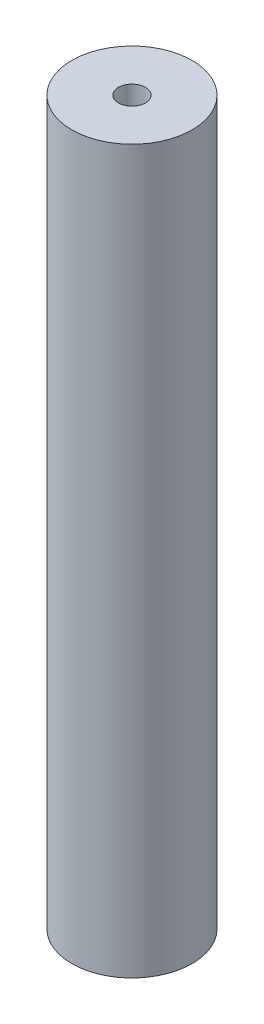
ISO-10303-21;
HEADER;
FILE_DESCRIPTION(('STEP AP214'),'2;1');
FILE_NAME('part.step','',(''),(''),'','','');
FILE_SCHEMA(('AUTOMOTIVE_DESIGN { 1 0 10303 214 1 1 1 1 }'));
ENDSEC;
DATA;
#1=APPLICATION_CONTEXT('core data for automotive mechanical design processes');
#2=APPLICATION_PROTOCOL_DEFINITION('international standard','automotive_design',2000,#1);
#3=PRODUCT_CONTEXT('',#1,'mechanical');
#4=PRODUCT('Part','Part','',(#3));
#5=PRODUCT_RELATED_PRODUCT_CATEGORY('part','',(#4));
#6=PRODUCT_DEFINITION_FORMATION('','',#4);
#7=PRODUCT_DEFINITION_CONTEXT('part definition',#1,'design');
#8=PRODUCT_DEFINITION('design','',#6,#7);
#9=PRODUCT_DEFINITION_SHAPE('','',#8);
#10=(LENGTH_UNIT() NAMED_UNIT(*) SI_UNIT(.MILLI.,.METRE.));
#11=(NAMED_UNIT(*) PLANE_ANGLE_UNIT() SI_UNIT($,.RADIAN.));
#12=(NAMED_UNIT(*) SI_UNIT($,.STERADIAN.) SOLID_ANGLE_UNIT());
#13=UNCERTAINTY_MEASURE_WITH_UNIT(LENGTH_MEASURE(1.E-05),#10,'distance_accuracy_value','');
#14=(GEOMETRIC_REPRESENTATION_CONTEXT(3) GLOBAL_UNCERTAINTY_ASSIGNED_CONTEXT((#13)) GLOBAL_UNIT_ASSIGNED_CONTEXT((#10,
#11,#12)) REPRESENTATION_CONTEXT('',''));
#15=CARTESIAN_POINT('',(0.,0.,0.));
#16=DIRECTION('',(0.,0.,1.));
#17=DIRECTION('',(1.,0.,0.));
#18=AXIS2_PLACEMENT_3D('',#15,#16,#17);
#19=CARTESIAN_POINT('',(0.,120.,0.));
#20=DIRECTION('',(0.,-1.,0.));
#21=DIRECTION('',(0.,0.,-1.));
#22=AXIS2_PLACEMENT_3D('',#19,#20,#21);
#23=CYLINDRICAL_SURFACE('',#22,10.);
#24=CARTESIAN_POINT('',(0.,120.,0.));
#25=DIRECTION('',(0.,1.,0.));
#26=DIRECTION('',(0.,0.,1.));
#27=AXIS2_PLACEMENT_3D('',#24,#25,#26);
#28=CIRCLE('',#27,10.);
#29=CARTESIAN_POINT('',(0.,120.,10.));
#30=VERTEX_POINT('',#29);
#31=EDGE_CURVE('E10',#30,#30,#28,.T.);
#32=ORIENTED_EDGE('',*,*,#31,.F.);
#33=EDGE_LOOP('',(#32));
#34=FACE_BOUND('',#33,.T.);
#35=CARTESIAN_POINT('',(0.,0.,0.));
#36=DIRECTION('',(0.,1.,0.));
#37=DIRECTION('',(0.,0.,1.));
#38=AXIS2_PLACEMENT_3D('',#35,#36,#37);
#39=CIRCLE('',#38,10.);
#40=CARTESIAN_POINT('',(0.,0.,10.));
#41=VERTEX_POINT('',#40);
#42=EDGE_CURVE('E33',#41,#41,#39,.T.);
#43=ORIENTED_EDGE('',*,*,#42,.T.);
#44=EDGE_LOOP('',(#43));
#45=FACE_BOUND('',#44,.T.);
#46=ADVANCED_FACE('F30',(#34,#45),#23,.T.);
#47=CARTESIAN_POINT('',(0.,120.,0.));
#48=DIRECTION('',(0.,1.,0.));
#49=DIRECTION('',(0.,0.,1.));
#50=AXIS2_PLACEMENT_3D('',#47,#48,#49);
#51=PLANE('',#50);
#52=CARTESIAN_POINT('',(0.,120.,0.));
#53=DIRECTION('',(0.,1.,0.));
#54=DIRECTION('',(0.,0.,1.));
#55=AXIS2_PLACEMENT_3D('',#52,#53,#54);
#56=CIRCLE('',#55,2.25);
#57=CARTESIAN_POINT('',(0.,120.,2.25));
#58=VERTEX_POINT('',#57);
#59=EDGE_CURVE('E42',#58,#58,#56,.T.);
#60=ORIENTED_EDGE('',*,*,#59,.F.);
#61=EDGE_LOOP('',(#60));
#62=FACE_BOUND('',#61,.T.);
#63=ORIENTED_EDGE('',*,*,#31,.T.);
#64=EDGE_LOOP('',(#63));
#65=FACE_BOUND('',#64,.T.);
#66=ADVANCED_FACE('F57',(#62,#65),#51,.T.);
#67=CARTESIAN_POINT('',(0.,0.,0.));
#68=DIRECTION('',(0.,1.,0.));
#69=DIRECTION('',(0.,0.,1.));
#70=AXIS2_PLACEMENT_3D('',#67,#68,#69);
#71=PLANE('',#70);
#72=CARTESIAN_POINT('',(0.,0.,0.));
#73=DIRECTION('',(0.,1.,0.));
#74=DIRECTION('',(0.,0.,1.));
#75=AXIS2_PLACEMENT_3D('',#72,#73,#74);
#76=CIRCLE('',#75,2.25);
#77=CARTESIAN_POINT('',(0.,0.,2.25));
#78=VERTEX_POINT('',#77);
#79=EDGE_CURVE('E40',#78,#78,#76,.T.);
#80=ORIENTED_EDGE('',*,*,#79,.T.);
#81=EDGE_LOOP('',(#80));
#82=FACE_BOUND('',#81,.T.);
#83=ORIENTED_EDGE('',*,*,#42,.F.);
#84=EDGE_LOOP('',(#83));
#85=FACE_BOUND('',#84,.T.);
#86=ADVANCED_FACE('F48',(#82,#85),#71,.F.);
#87=CARTESIAN_POINT('',(0.,0.,0.));
#88=DIRECTION('',(0.,1.,0.));
#89=DIRECTION('',(0.,0.,1.));
#90=AXIS2_PLACEMENT_3D('',#87,#88,#89);
#91=CYLINDRICAL_SURFACE('',#90,2.25);
#92=ORIENTED_EDGE('',*,*,#79,.F.);
#93=EDGE_LOOP('',(#92));
#94=FACE_BOUND('',#93,.T.);
#95=ORIENTED_EDGE('',*,*,#59,.T.);
#96=EDGE_LOOP('',(#95));
#97=FACE_BOUND('',#96,.T.);
#98=ADVANCED_FACE('F51',(#94,#97),#91,.F.);
#99=CLOSED_SHELL('',(#46,#66,#86,#98));
#100=MANIFOLD_SOLID_BREP('B2',#99);
#101=ADVANCED_BREP_SHAPE_REPRESENTATION('',(#18,#100),#14);
#102=SHAPE_DEFINITION_REPRESENTATION(#9,#101);
ENDSEC;
END-ISO-10303-21;
